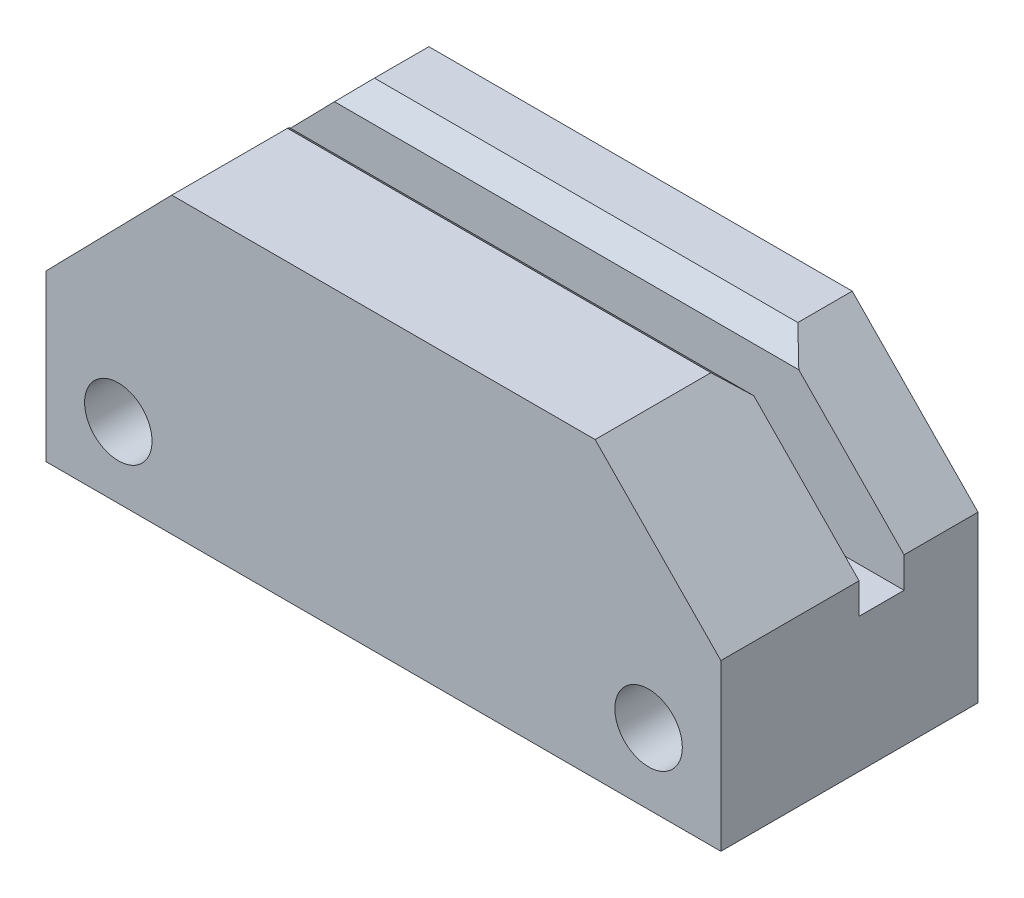
ISO-10303-21;
HEADER;
FILE_DESCRIPTION(('STEP AP214'),'2;1');
FILE_NAME('part.step','',(''),(''),'','','');
FILE_SCHEMA(('AUTOMOTIVE_DESIGN { 1 0 10303 214 1 1 1 1 }'));
ENDSEC;
DATA;
#1=APPLICATION_CONTEXT('core data for automotive mechanical design processes');
#2=APPLICATION_PROTOCOL_DEFINITION('international standard','automotive_design',2000,#1);
#3=PRODUCT_CONTEXT('',#1,'mechanical');
#4=PRODUCT('Part','Part','',(#3));
#5=PRODUCT_RELATED_PRODUCT_CATEGORY('part','',(#4));
#6=PRODUCT_DEFINITION_FORMATION('','',#4);
#7=PRODUCT_DEFINITION_CONTEXT('part definition',#1,'design');
#8=PRODUCT_DEFINITION('design','',#6,#7);
#9=PRODUCT_DEFINITION_SHAPE('','',#8);
#10=(LENGTH_UNIT() NAMED_UNIT(*) SI_UNIT(.MILLI.,.METRE.));
#11=(NAMED_UNIT(*) PLANE_ANGLE_UNIT() SI_UNIT($,.RADIAN.));
#12=(NAMED_UNIT(*) SI_UNIT($,.STERADIAN.) SOLID_ANGLE_UNIT());
#13=UNCERTAINTY_MEASURE_WITH_UNIT(LENGTH_MEASURE(1.E-05),#10,'distance_accuracy_value','');
#14=(GEOMETRIC_REPRESENTATION_CONTEXT(3) GLOBAL_UNCERTAINTY_ASSIGNED_CONTEXT((#13)) GLOBAL_UNIT_ASSIGNED_CONTEXT((#10,
#11,#12)) REPRESENTATION_CONTEXT('',''));
#15=CARTESIAN_POINT('',(0.,0.,0.));
#16=DIRECTION('',(0.,0.,1.));
#17=DIRECTION('',(1.,0.,0.));
#18=AXIS2_PLACEMENT_3D('',#15,#16,#17);
#19=CARTESIAN_POINT('',(9.41385546640759,1.0414,0.));
#20=DIRECTION('',(0.,0.,-1.));
#21=DIRECTION('',(-1.,0.,0.));
#22=AXIS2_PLACEMENT_3D('',#19,#20,#21);
#23=CYLINDRICAL_SURFACE('',#22,1.1938);
#24=CARTESIAN_POINT('',(9.41385546640759,1.0414,2.159));
#25=DIRECTION('',(0.,0.,-1.));
#26=DIRECTION('',(-1.,0.,0.));
#27=AXIS2_PLACEMENT_3D('',#24,#25,#26);
#28=CIRCLE('',#27,1.1938);
#29=CARTESIAN_POINT('',(9.41385546640759,2.2352,2.159));
#30=VERTEX_POINT('',#29);
#31=CARTESIAN_POINT('',(10.0269757964685,2.06572509530227,2.159));
#32=VERTEX_POINT('',#31);
#33=EDGE_CURVE('E232',#30,#32,#28,.T.);
#34=ORIENTED_EDGE('',*,*,#33,.F.);
#35=DIRECTION('',(0.,0.,1.));
#36=VECTOR('',#35,1.);
#37=CARTESIAN_POINT('',(9.41385546640759,2.2352,0.));
#38=LINE('',#37,#36);
#39=CARTESIAN_POINT('',(9.41385546640759,2.2352,0.));
#40=VERTEX_POINT('',#39);
#41=EDGE_CURVE('E178',#30,#40,#38,.F.);
#42=ORIENTED_EDGE('',*,*,#41,.T.);
#43=CARTESIAN_POINT('',(9.41385546640759,1.0414,0.));
#44=DIRECTION('',(0.,0.,-1.));
#45=DIRECTION('',(-1.,0.,0.));
#46=AXIS2_PLACEMENT_3D('',#43,#44,#45);
#47=CIRCLE('',#46,1.1938);
#48=CARTESIAN_POINT('',(10.0269757964685,2.06572509530224,0.));
#49=VERTEX_POINT('',#48);
#50=EDGE_CURVE('E19',#49,#40,#47,.F.);
#51=ORIENTED_EDGE('',*,*,#50,.F.);
#52=DIRECTION('',(0.,0.,1.));
#53=VECTOR('',#52,1.);
#54=CARTESIAN_POINT('',(10.0269757964685,2.06572509530225,0.));
#55=LINE('',#54,#53);
#56=EDGE_CURVE('E172',#49,#32,#55,.T.);
#57=ORIENTED_EDGE('',*,*,#56,.T.);
#58=EDGE_LOOP('',(#34,#42,#51,#57));
#59=FACE_BOUND('',#58,.T.);
#60=ADVANCED_FACE('F16',(#59),#23,.F.);
#61=CARTESIAN_POINT('',(13.335,4.2530223123202,2.921));
#62=DIRECTION('',(0.,-0.681925426496933,-0.731421706471018));
#63=DIRECTION('',(0.,0.731421706471018,-0.681925426496933));
#64=AXIS2_PLACEMENT_3D('',#61,#62,#63);
#65=PLANE('',#64);
#66=DIRECTION('',(-1.,0.,0.));
#67=VECTOR('',#66,1.);
#68=CARTESIAN_POINT('',(13.335,4.2530223123202,2.921));
#69=LINE('',#68,#67);
#70=CARTESIAN_POINT('',(-9.17443469446938,4.2530223123202,2.921));
#71=VERTEX_POINT('',#70);
#72=CARTESIAN_POINT('',(9.17443469446937,4.2530223123202,2.921));
#73=VERTEX_POINT('',#72);
#74=EDGE_CURVE('E258',#71,#73,#69,.F.);
#75=ORIENTED_EDGE('',*,*,#74,.T.);
#76=DIRECTION('',(0.581903337800259,-0.594834523084709,0.554581279528532));
#77=VECTOR('',#76,1.);
#78=CARTESIAN_POINT('',(8.36543478260869,5.08,2.14998499267215));
#79=LINE('',#78,#77);
#80=CARTESIAN_POINT('',(8.36543478260869,5.08,2.14998499267215));
#81=VERTEX_POINT('',#80);
#82=EDGE_CURVE('E180',#81,#73,#79,.T.);
#83=ORIENTED_EDGE('',*,*,#82,.F.);
#84=DIRECTION('',(1.,0.,0.));
#85=VECTOR('',#84,1.);
#86=CARTESIAN_POINT('',(13.335,5.08,2.14998499267215));
#87=LINE('',#86,#85);
#88=CARTESIAN_POINT('',(-8.3654347826087,5.08,2.14998499267215));
#89=VERTEX_POINT('',#88);
#90=EDGE_CURVE('E231',#89,#81,#87,.T.);
#91=ORIENTED_EDGE('',*,*,#90,.F.);
#92=DIRECTION('',(0.581903337800257,0.59483452308471,-0.554581279528533));
#93=VECTOR('',#92,1.);
#94=CARTESIAN_POINT('',(-9.17443469446937,4.2530223123202,2.921));
#95=LINE('',#94,#93);
#96=EDGE_CURVE('E173',#71,#89,#95,.T.);
#97=ORIENTED_EDGE('',*,*,#96,.F.);
#98=EDGE_LOOP('',(#75,#83,#91,#97));
#99=FACE_BOUND('',#98,.T.);
#100=ADVANCED_FACE('F259',(#99),#65,.F.);
#101=CARTESIAN_POINT('',(0.,0.,2.159));
#102=DIRECTION('',(0.,0.,-1.));
#103=DIRECTION('',(-1.,0.,0.));
#104=AXIS2_PLACEMENT_3D('',#101,#102,#103);
#105=PLANE('',#104);
#106=CARTESIAN_POINT('',(-8.636,1.016,2.159));
#107=DIRECTION('',(0.,0.,-1.));
#108=DIRECTION('',(-1.,0.,0.));
#109=AXIS2_PLACEMENT_3D('',#106,#107,#108);
#110=CIRCLE('',#109,1.2192);
#111=CARTESIAN_POINT('',(-9.8552,1.016,2.159));
#112=VERTEX_POINT('',#111);
#113=EDGE_CURVE('E229',#112,#112,#110,.T.);
#114=ORIENTED_EDGE('',*,*,#113,.T.);
#115=EDGE_LOOP('',(#114));
#116=FACE_BOUND('',#115,.T.);
#117=ADVANCED_FACE('F656',(#116),#105,.T.);
#118=CARTESIAN_POINT('',(10.0269757964685,2.06572509530225,0.));
#119=DIRECTION('',(0.513587141950879,0.858037439522733,0.));
#120=DIRECTION('',(-0.858037439522733,0.513587141950879,0.));
#121=AXIS2_PLACEMENT_3D('',#118,#119,#120);
#122=PLANE('',#121);
#123=DIRECTION('',(0.858037439522774,-0.513587141950811,0.));
#124=VECTOR('',#123,1.);
#125=CARTESIAN_POINT('',(10.0269757964685,2.06572509530225,2.159));
#126=LINE('',#125,#124);
#127=CARTESIAN_POINT('',(10.033,2.06211924626615,2.159));
#128=VERTEX_POINT('',#127);
#129=EDGE_CURVE('E183',#32,#128,#126,.T.);
#130=ORIENTED_EDGE('',*,*,#129,.F.);
#131=ORIENTED_EDGE('',*,*,#56,.F.);
#132=DIRECTION('',(-0.858037439522733,0.513587141950879,0.));
#133=VECTOR('',#132,1.);
#134=CARTESIAN_POINT('',(10.0269757964685,2.06572509530225,0.));
#135=LINE('',#134,#133);
#136=CARTESIAN_POINT('',(10.033,2.06211924626612,0.));
#137=VERTEX_POINT('',#136);
#138=EDGE_CURVE('E162',#137,#49,#135,.T.);
#139=ORIENTED_EDGE('',*,*,#138,.F.);
#140=DIRECTION('',(0.,0.,-1.));
#141=VECTOR('',#140,1.);
#142=CARTESIAN_POINT('',(10.033,2.06211924626613,0.));
#143=LINE('',#142,#141);
#144=EDGE_CURVE('E228',#137,#128,#143,.F.);
#145=ORIENTED_EDGE('',*,*,#144,.T.);
#146=EDGE_LOOP('',(#130,#131,#139,#145));
#147=FACE_BOUND('',#146,.T.);
#148=ADVANCED_FACE('F181',(#147),#122,.F.);
#149=CARTESIAN_POINT('',(9.40683455653351,-0.2032,0.));
#150=DIRECTION('',(0.,-1.,0.));
#151=DIRECTION('',(0.,0.,-1.));
#152=AXIS2_PLACEMENT_3D('',#149,#150,#151);
#153=PLANE('',#152);
#154=DIRECTION('',(-1.,0.,0.));
#155=VECTOR('',#154,1.);
#156=CARTESIAN_POINT('',(0.,-0.2032,2.159));
#157=LINE('',#156,#155);
#158=CARTESIAN_POINT('',(9.40683455653351,-0.2032,2.159));
#159=VERTEX_POINT('',#158);
#160=CARTESIAN_POINT('',(8.4582,-0.2032,2.159));
#161=VERTEX_POINT('',#160);
#162=EDGE_CURVE('E235',#159,#161,#157,.T.);
#163=ORIENTED_EDGE('',*,*,#162,.F.);
#164=DIRECTION('',(0.,0.,-1.));
#165=VECTOR('',#164,1.);
#166=CARTESIAN_POINT('',(9.40683455653351,-0.2032,0.));
#167=LINE('',#166,#165);
#168=CARTESIAN_POINT('',(9.40683455653351,-0.2032,0.));
#169=VERTEX_POINT('',#168);
#170=EDGE_CURVE('E227',#159,#169,#167,.T.);
#171=ORIENTED_EDGE('',*,*,#170,.T.);
#172=DIRECTION('',(1.,0.,0.));
#173=VECTOR('',#172,1.);
#174=CARTESIAN_POINT('',(9.40683455653351,-0.2032,0.));
#175=LINE('',#174,#173);
#176=CARTESIAN_POINT('',(8.4582,-0.2032,0.));
#177=VERTEX_POINT('',#176);
#178=EDGE_CURVE('E185',#177,#169,#175,.T.);
#179=ORIENTED_EDGE('',*,*,#178,.F.);
#180=DIRECTION('',(0.,0.,-1.));
#181=VECTOR('',#180,1.);
#182=CARTESIAN_POINT('',(8.4582,-0.2032,0.));
#183=LINE('',#182,#181);
#184=EDGE_CURVE('E223',#177,#161,#183,.F.);
#185=ORIENTED_EDGE('',*,*,#184,.T.);
#186=EDGE_LOOP('',(#163,#171,#179,#185));
#187=FACE_BOUND('',#186,.T.);
#188=ADVANCED_FACE('F641',(#187),#153,.F.);
#189=CARTESIAN_POINT('',(7.239,1.016,0.));
#190=DIRECTION('',(-1.,0.,0.));
#191=DIRECTION('',(0.,0.,1.));
#192=AXIS2_PLACEMENT_3D('',#189,#190,#191);
#193=PLANE('',#192);
#194=DIRECTION('',(0.,1.,0.));
#195=VECTOR('',#194,1.);
#196=CARTESIAN_POINT('',(7.239,0.,2.159));
#197=LINE('',#196,#195);
#198=CARTESIAN_POINT('',(7.239,1.016,2.159));
#199=VERTEX_POINT('',#198);
#200=CARTESIAN_POINT('',(7.239,1.0414,2.159));
#201=VERTEX_POINT('',#200);
#202=EDGE_CURVE('E298',#199,#201,#197,.T.);
#203=ORIENTED_EDGE('',*,*,#202,.F.);
#204=DIRECTION('',(0.,0.,-1.));
#205=VECTOR('',#204,1.);
#206=CARTESIAN_POINT('',(7.239,1.016,0.));
#207=LINE('',#206,#205);
#208=CARTESIAN_POINT('',(7.239,1.016,0.));
#209=VERTEX_POINT('',#208);
#210=EDGE_CURVE('E222',#199,#209,#207,.T.);
#211=ORIENTED_EDGE('',*,*,#210,.T.);
#212=DIRECTION('',(0.,1.,0.));
#213=VECTOR('',#212,1.);
#214=CARTESIAN_POINT('',(7.239,1.016,0.));
#215=LINE('',#214,#213);
#216=CARTESIAN_POINT('',(7.239,1.0414,0.));
#217=VERTEX_POINT('',#216);
#218=EDGE_CURVE('E187',#217,#209,#215,.F.);
#219=ORIENTED_EDGE('',*,*,#218,.F.);
#220=DIRECTION('',(0.,0.,-1.));
#221=VECTOR('',#220,1.);
#222=CARTESIAN_POINT('',(7.239,1.0414,0.));
#223=LINE('',#222,#221);
#224=EDGE_CURVE('E218',#217,#201,#223,.F.);
#225=ORIENTED_EDGE('',*,*,#224,.T.);
#226=EDGE_LOOP('',(#203,#211,#219,#225));
#227=FACE_BOUND('',#226,.T.);
#228=ADVANCED_FACE('F312',(#227),#193,.F.);
#229=CARTESIAN_POINT('',(0.,0.,2.159));
#230=DIRECTION('',(0.,0.,-1.));
#231=DIRECTION('',(-1.,0.,0.));
#232=AXIS2_PLACEMENT_3D('',#229,#230,#231);
#233=PLANE('',#232);
#234=CARTESIAN_POINT('',(8.4328,1.0414,2.159));
#235=DIRECTION('',(0.,0.,-1.));
#236=DIRECTION('',(-1.,0.,0.));
#237=AXIS2_PLACEMENT_3D('',#234,#235,#236);
#238=CIRCLE('',#237,1.1938);
#239=CARTESIAN_POINT('',(8.4328,2.2352,2.159));
#240=VERTEX_POINT('',#239);
#241=EDGE_CURVE('E215',#201,#240,#238,.T.);
#242=ORIENTED_EDGE('',*,*,#241,.T.);
#243=DIRECTION('',(1.,0.,0.));
#244=VECTOR('',#243,1.);
#245=CARTESIAN_POINT('',(8.4328,2.2352,2.159));
#246=LINE('',#245,#244);
#247=EDGE_CURVE('E297',#240,#30,#246,.T.);
#248=ORIENTED_EDGE('',*,*,#247,.T.);
#249=ORIENTED_EDGE('',*,*,#33,.T.);
#250=ORIENTED_EDGE('',*,*,#129,.T.);
#251=CARTESIAN_POINT('',(9.40683455653351,1.016,2.159));
#252=DIRECTION('',(0.,0.,-1.));
#253=DIRECTION('',(-1.,0.,0.));
#254=AXIS2_PLACEMENT_3D('',#251,#252,#253);
#255=CIRCLE('',#254,1.2192);
#256=EDGE_CURVE('E224',#128,#159,#255,.T.);
#257=ORIENTED_EDGE('',*,*,#256,.T.);
#258=ORIENTED_EDGE('',*,*,#162,.T.);
#259=CARTESIAN_POINT('',(8.4582,1.016,2.159));
#260=DIRECTION('',(0.,0.,-1.));
#261=DIRECTION('',(-1.,0.,0.));
#262=AXIS2_PLACEMENT_3D('',#259,#260,#261);
#263=CIRCLE('',#262,1.2192);
#264=EDGE_CURVE('E219',#161,#199,#263,.T.);
#265=ORIENTED_EDGE('',*,*,#264,.T.);
#266=ORIENTED_EDGE('',*,*,#202,.T.);
#267=EDGE_LOOP('',(#242,#248,#249,#250,#257,#258,#265,#266));
#268=FACE_BOUND('',#267,.T.);
#269=ADVANCED_FACE('F303',(#268),#233,.T.);
#270=CARTESIAN_POINT('',(8.4328,2.2352,0.));
#271=DIRECTION('',(0.,1.,0.));
#272=DIRECTION('',(0.,0.,1.));
#273=AXIS2_PLACEMENT_3D('',#270,#271,#272);
#274=PLANE('',#273);
#275=ORIENTED_EDGE('',*,*,#247,.F.);
#276=DIRECTION('',(0.,0.,-1.));
#277=VECTOR('',#276,1.);
#278=CARTESIAN_POINT('',(8.4328,2.2352,0.));
#279=LINE('',#278,#277);
#280=CARTESIAN_POINT('',(8.4328,2.2352,0.));
#281=VERTEX_POINT('',#280);
#282=EDGE_CURVE('E217',#240,#281,#279,.T.);
#283=ORIENTED_EDGE('',*,*,#282,.T.);
#284=DIRECTION('',(1.,0.,0.));
#285=VECTOR('',#284,1.);
#286=CARTESIAN_POINT('',(8.4328,2.2352,0.));
#287=LINE('',#286,#285);
#288=EDGE_CURVE('E295',#40,#281,#287,.F.);
#289=ORIENTED_EDGE('',*,*,#288,.F.);
#290=ORIENTED_EDGE('',*,*,#41,.F.);
#291=EDGE_LOOP('',(#275,#283,#289,#290));
#292=FACE_BOUND('',#291,.T.);
#293=ADVANCED_FACE('F320',(#292),#274,.F.);
#294=CARTESIAN_POINT('',(13.335,-1.21361666226093,2.921));
#295=DIRECTION('',(0.,0.,-1.));
#296=DIRECTION('',(-1.,0.,0.));
#297=AXIS2_PLACEMENT_3D('',#294,#295,#296);
#298=PLANE('',#297);
#299=DIRECTION('',(0.,1.,0.));
#300=VECTOR('',#299,1.);
#301=CARTESIAN_POINT('',(13.335,-1.21361666226093,2.921));
#302=LINE('',#301,#300);
#303=CARTESIAN_POINT('',(13.335,0.,2.921));
#304=VERTEX_POINT('',#303);
#305=CARTESIAN_POINT('',(13.335,-1.21361666226093,2.921));
#306=VERTEX_POINT('',#305);
#307=EDGE_CURVE('E263',#304,#306,#302,.F.);
#308=ORIENTED_EDGE('',*,*,#307,.F.);
#309=DIRECTION('',(-0.699294155463731,0.714834025585147,0.));
#310=VECTOR('',#309,1.);
#311=CARTESIAN_POINT('',(7.62,5.842,2.921));
#312=LINE('',#311,#310);
#313=EDGE_CURVE('E250',#73,#304,#312,.F.);
#314=ORIENTED_EDGE('',*,*,#313,.F.);
#315=ORIENTED_EDGE('',*,*,#74,.F.);
#316=DIRECTION('',(0.699294155463731,0.714834025585147,0.));
#317=VECTOR('',#316,1.);
#318=CARTESIAN_POINT('',(-7.62,5.842,2.921));
#319=LINE('',#318,#317);
#320=CARTESIAN_POINT('',(-13.335,0.,2.921));
#321=VERTEX_POINT('',#320);
#322=EDGE_CURVE('E278',#71,#321,#319,.F.);
#323=ORIENTED_EDGE('',*,*,#322,.T.);
#324=DIRECTION('',(0.,1.,0.));
#325=VECTOR('',#324,1.);
#326=CARTESIAN_POINT('',(-13.335,-1.21361666226093,2.921));
#327=LINE('',#326,#325);
#328=CARTESIAN_POINT('',(-13.335,-1.21361666226093,2.921));
#329=VERTEX_POINT('',#328);
#330=EDGE_CURVE('E264',#329,#321,#327,.T.);
#331=ORIENTED_EDGE('',*,*,#330,.F.);
#332=DIRECTION('',(1.,0.,0.));
#333=VECTOR('',#332,1.);
#334=CARTESIAN_POINT('',(13.335,-1.21361666226093,2.921));
#335=LINE('',#334,#333);
#336=EDGE_CURVE('E268',#329,#306,#335,.T.);
#337=ORIENTED_EDGE('',*,*,#336,.T.);
#338=EDGE_LOOP('',(#308,#314,#315,#323,#331,#337));
#339=FACE_BOUND('',#338,.T.);
#340=ADVANCED_FACE('F266',(#339),#298,.F.);
#341=CARTESIAN_POINT('',(13.335,5.08,0.));
#342=DIRECTION('',(0.,1.,0.));
#343=DIRECTION('',(0.,0.,1.));
#344=AXIS2_PLACEMENT_3D('',#341,#342,#343);
#345=PLANE('',#344);
#346=DIRECTION('',(0.,0.,1.));
#347=VECTOR('',#346,1.);
#348=CARTESIAN_POINT('',(-8.3654347826087,5.08,0.));
#349=LINE('',#348,#347);
#350=CARTESIAN_POINT('',(-8.3654347826087,5.08,0.));
#351=VERTEX_POINT('',#350);
#352=EDGE_CURVE('E272',#351,#89,#349,.T.);
#353=ORIENTED_EDGE('',*,*,#352,.T.);
#354=ORIENTED_EDGE('',*,*,#90,.T.);
#355=DIRECTION('',(0.,0.,1.));
#356=VECTOR('',#355,1.);
#357=CARTESIAN_POINT('',(8.3654347826087,5.08,0.));
#358=LINE('',#357,#356);
#359=CARTESIAN_POINT('',(8.36543478260869,5.08,0.));
#360=VERTEX_POINT('',#359);
#361=EDGE_CURVE('E253',#360,#81,#358,.T.);
#362=ORIENTED_EDGE('',*,*,#361,.F.);
#363=DIRECTION('',(1.,0.,0.));
#364=VECTOR('',#363,1.);
#365=CARTESIAN_POINT('',(0.,5.08,0.));
#366=LINE('',#365,#364);
#367=EDGE_CURVE('E408',#360,#351,#366,.F.);
#368=ORIENTED_EDGE('',*,*,#367,.T.);
#369=EDGE_LOOP('',(#353,#354,#362,#368));
#370=FACE_BOUND('',#369,.T.);
#371=ADVANCED_FACE('F328',(#370),#345,.T.);
#372=CARTESIAN_POINT('',(-8.636,1.016,0.));
#373=DIRECTION('',(0.,0.,-1.));
#374=DIRECTION('',(-1.,0.,0.));
#375=AXIS2_PLACEMENT_3D('',#372,#373,#374);
#376=CYLINDRICAL_SURFACE('',#375,1.2192);
#377=ORIENTED_EDGE('',*,*,#113,.F.);
#378=EDGE_LOOP('',(#377));
#379=FACE_BOUND('',#378,.T.);
#380=CARTESIAN_POINT('',(-8.636,1.016,0.));
#381=DIRECTION('',(0.,0.,-1.));
#382=DIRECTION('',(-1.,0.,0.));
#383=AXIS2_PLACEMENT_3D('',#380,#381,#382);
#384=CIRCLE('',#383,1.2192);
#385=CARTESIAN_POINT('',(-9.8552,1.016,0.));
#386=VERTEX_POINT('',#385);
#387=EDGE_CURVE('E211',#386,#386,#384,.T.);
#388=ORIENTED_EDGE('',*,*,#387,.T.);
#389=EDGE_LOOP('',(#388));
#390=FACE_BOUND('',#389,.T.);
#391=ADVANCED_FACE('F397',(#379,#390),#376,.F.);
#392=CARTESIAN_POINT('',(9.40683455653351,1.016,0.));
#393=DIRECTION('',(0.,0.,-1.));
#394=DIRECTION('',(-1.,0.,0.));
#395=AXIS2_PLACEMENT_3D('',#392,#393,#394);
#396=CYLINDRICAL_SURFACE('',#395,1.2192);
#397=ORIENTED_EDGE('',*,*,#256,.F.);
#398=ORIENTED_EDGE('',*,*,#144,.F.);
#399=CARTESIAN_POINT('',(9.40683455653351,1.016,0.));
#400=DIRECTION('',(0.,0.,-1.));
#401=DIRECTION('',(-1.,0.,0.));
#402=AXIS2_PLACEMENT_3D('',#399,#400,#401);
#403=CIRCLE('',#402,1.2192);
#404=EDGE_CURVE('E168',#137,#169,#403,.T.);
#405=ORIENTED_EDGE('',*,*,#404,.T.);
#406=ORIENTED_EDGE('',*,*,#170,.F.);
#407=EDGE_LOOP('',(#397,#398,#405,#406));
#408=FACE_BOUND('',#407,.T.);
#409=ADVANCED_FACE('F394',(#408),#396,.F.);
#410=CARTESIAN_POINT('',(8.4582,1.016,0.));
#411=DIRECTION('',(0.,0.,-1.));
#412=DIRECTION('',(-1.,0.,0.));
#413=AXIS2_PLACEMENT_3D('',#410,#411,#412);
#414=CYLINDRICAL_SURFACE('',#413,1.2192);
#415=ORIENTED_EDGE('',*,*,#264,.F.);
#416=ORIENTED_EDGE('',*,*,#184,.F.);
#417=CARTESIAN_POINT('',(8.4582,1.016,0.));
#418=DIRECTION('',(0.,0.,-1.));
#419=DIRECTION('',(-1.,0.,0.));
#420=AXIS2_PLACEMENT_3D('',#417,#418,#419);
#421=CIRCLE('',#420,1.2192);
#422=EDGE_CURVE('E207',#177,#209,#421,.T.);
#423=ORIENTED_EDGE('',*,*,#422,.T.);
#424=ORIENTED_EDGE('',*,*,#210,.F.);
#425=EDGE_LOOP('',(#415,#416,#423,#424));
#426=FACE_BOUND('',#425,.T.);
#427=ADVANCED_FACE('F310',(#426),#414,.F.);
#428=CARTESIAN_POINT('',(8.4328,1.0414,0.));
#429=DIRECTION('',(0.,0.,-1.));
#430=DIRECTION('',(-1.,0.,0.));
#431=AXIS2_PLACEMENT_3D('',#428,#429,#430);
#432=CYLINDRICAL_SURFACE('',#431,1.1938);
#433=ORIENTED_EDGE('',*,*,#241,.F.);
#434=ORIENTED_EDGE('',*,*,#224,.F.);
#435=CARTESIAN_POINT('',(8.4328,1.0414,0.));
#436=DIRECTION('',(0.,0.,-1.));
#437=DIRECTION('',(-1.,0.,0.));
#438=AXIS2_PLACEMENT_3D('',#435,#436,#437);
#439=CIRCLE('',#438,1.1938);
#440=EDGE_CURVE('E203',#217,#281,#439,.T.);
#441=ORIENTED_EDGE('',*,*,#440,.T.);
#442=ORIENTED_EDGE('',*,*,#282,.F.);
#443=EDGE_LOOP('',(#433,#434,#441,#442));
#444=FACE_BOUND('',#443,.T.);
#445=ADVANCED_FACE('F318',(#444),#432,.F.);
#446=CARTESIAN_POINT('',(13.335,5.08,5.58600231437815));
#447=DIRECTION('',(0.,-0.731421706470944,0.681925426497013));
#448=DIRECTION('',(0.,-0.681925426497013,-0.731421706470944));
#449=AXIS2_PLACEMENT_3D('',#446,#447,#448);
#450=PLANE('',#449);
#451=DIRECTION('',(1.,0.,0.));
#452=VECTOR('',#451,1.);
#453=CARTESIAN_POINT('',(13.335,4.2530223123202,4.699));
#454=LINE('',#453,#452);
#455=CARTESIAN_POINT('',(9.17443469446937,4.2530223123202,4.699));
#456=VERTEX_POINT('',#455);
#457=CARTESIAN_POINT('',(-9.17443469446938,4.25302231232019,4.699));
#458=VERTEX_POINT('',#457);
#459=EDGE_CURVE('E423',#456,#458,#454,.F.);
#460=ORIENTED_EDGE('',*,*,#459,.T.);
#461=DIRECTION('',(-0.554950289504118,-0.567282518159767,-0.608457657335011));
#462=VECTOR('',#461,1.);
#463=CARTESIAN_POINT('',(-8.36543478260871,5.08,5.58600231437815));
#464=LINE('',#463,#462);
#465=CARTESIAN_POINT('',(-8.3654347826087,5.08,5.58600231437815));
#466=VERTEX_POINT('',#465);
#467=EDGE_CURVE('E282',#466,#458,#464,.T.);
#468=ORIENTED_EDGE('',*,*,#467,.F.);
#469=DIRECTION('',(1.,0.,0.));
#470=VECTOR('',#469,1.);
#471=CARTESIAN_POINT('',(13.335,5.08,5.58600231437815));
#472=LINE('',#471,#470);
#473=CARTESIAN_POINT('',(8.36543478260869,5.08,5.58600231437815));
#474=VERTEX_POINT('',#473);
#475=EDGE_CURVE('E206',#474,#466,#472,.F.);
#476=ORIENTED_EDGE('',*,*,#475,.F.);
#477=DIRECTION('',(-0.55495028950412,0.567282518159766,0.60845765733501));
#478=VECTOR('',#477,1.);
#479=CARTESIAN_POINT('',(9.17443469446937,4.2530223123202,4.699));
#480=LINE('',#479,#478);
#481=EDGE_CURVE('E280',#456,#474,#480,.T.);
#482=ORIENTED_EDGE('',*,*,#481,.F.);
#483=EDGE_LOOP('',(#460,#468,#476,#482));
#484=FACE_BOUND('',#483,.T.);
#485=ADVANCED_FACE('F385',(#484),#450,.F.);
#486=CARTESIAN_POINT('',(-7.62,5.842,0.));
#487=DIRECTION('',(0.714834025585147,-0.699294155463731,0.));
#488=DIRECTION('',(0.699294155463731,0.714834025585147,0.));
#489=AXIS2_PLACEMENT_3D('',#486,#487,#488);
#490=PLANE('',#489);
#491=ORIENTED_EDGE('',*,*,#352,.F.);
#492=DIRECTION('',(-0.699294155463731,-0.714834025585148,0.));
#493=VECTOR('',#492,1.);
#494=CARTESIAN_POINT('',(-8.3654347826087,5.08,0.));
#495=LINE('',#494,#493);
#496=CARTESIAN_POINT('',(-13.335,0.,0.));
#497=VERTEX_POINT('',#496);
#498=EDGE_CURVE('E214',#351,#497,#495,.T.);
#499=ORIENTED_EDGE('',*,*,#498,.T.);
#500=DIRECTION('',(0.,0.,1.));
#501=VECTOR('',#500,1.);
#502=CARTESIAN_POINT('',(-13.335,0.,0.));
#503=LINE('',#502,#501);
#504=EDGE_CURVE('E463',#321,#497,#503,.F.);
#505=ORIENTED_EDGE('',*,*,#504,.F.);
#506=ORIENTED_EDGE('',*,*,#322,.F.);
#507=ORIENTED_EDGE('',*,*,#96,.T.);
#508=EDGE_LOOP('',(#491,#499,#505,#506,#507));
#509=FACE_BOUND('',#508,.T.);
#510=ADVANCED_FACE('F382',(#509),#490,.F.);
#511=CARTESIAN_POINT('',(7.62,5.842,0.));
#512=DIRECTION('',(0.714834025585147,0.699294155463731,0.));
#513=DIRECTION('',(-0.699294155463731,0.714834025585147,0.));
#514=AXIS2_PLACEMENT_3D('',#511,#512,#513);
#515=PLANE('',#514);
#516=ORIENTED_EDGE('',*,*,#82,.T.);
#517=ORIENTED_EDGE('',*,*,#313,.T.);
#518=DIRECTION('',(0.,0.,-1.));
#519=VECTOR('',#518,1.);
#520=CARTESIAN_POINT('',(13.335,0.,0.));
#521=LINE('',#520,#519);
#522=CARTESIAN_POINT('',(13.335,0.,0.));
#523=VERTEX_POINT('',#522);
#524=EDGE_CURVE('E441',#523,#304,#521,.F.);
#525=ORIENTED_EDGE('',*,*,#524,.F.);
#526=DIRECTION('',(-0.699294155463731,0.714834025585148,0.));
#527=VECTOR('',#526,1.);
#528=CARTESIAN_POINT('',(13.335,0.,0.));
#529=LINE('',#528,#527);
#530=EDGE_CURVE('E417',#523,#360,#529,.T.);
#531=ORIENTED_EDGE('',*,*,#530,.T.);
#532=ORIENTED_EDGE('',*,*,#361,.T.);
#533=EDGE_LOOP('',(#516,#517,#525,#531,#532));
#534=FACE_BOUND('',#533,.T.);
#535=ADVANCED_FACE('F247',(#534),#515,.T.);
#536=CARTESIAN_POINT('',(13.335,-1.21361666226093,4.699));
#537=DIRECTION('',(0.,-1.,0.));
#538=DIRECTION('',(0.,0.,-1.));
#539=AXIS2_PLACEMENT_3D('',#536,#537,#538);
#540=PLANE('',#539);
#541=DIRECTION('',(0.,0.,-1.));
#542=VECTOR('',#541,1.);
#543=CARTESIAN_POINT('',(13.335,-1.21361666226093,0.));
#544=LINE('',#543,#542);
#545=CARTESIAN_POINT('',(13.335,-1.21361666226093,4.699));
#546=VERTEX_POINT('',#545);
#547=EDGE_CURVE('E430',#306,#546,#544,.F.);
#548=ORIENTED_EDGE('',*,*,#547,.F.);
#549=ORIENTED_EDGE('',*,*,#336,.F.);
#550=DIRECTION('',(0.,0.,1.));
#551=VECTOR('',#550,1.);
#552=CARTESIAN_POINT('',(-13.335,-1.21361666226093,0.));
#553=LINE('',#552,#551);
#554=CARTESIAN_POINT('',(-13.335,-1.21361666226093,4.699));
#555=VERTEX_POINT('',#554);
#556=EDGE_CURVE('E432',#555,#329,#553,.F.);
#557=ORIENTED_EDGE('',*,*,#556,.F.);
#558=DIRECTION('',(1.,0.,0.));
#559=VECTOR('',#558,1.);
#560=CARTESIAN_POINT('',(13.335,-1.21361666226093,4.699));
#561=LINE('',#560,#559);
#562=EDGE_CURVE('E270',#555,#546,#561,.T.);
#563=ORIENTED_EDGE('',*,*,#562,.T.);
#564=EDGE_LOOP('',(#548,#549,#557,#563));
#565=FACE_BOUND('',#564,.T.);
#566=ADVANCED_FACE('F375',(#565),#540,.F.);
#567=CARTESIAN_POINT('',(13.335,4.2530223123202,4.699));
#568=DIRECTION('',(0.,0.,1.));
#569=DIRECTION('',(1.,0.,0.));
#570=AXIS2_PLACEMENT_3D('',#567,#568,#569);
#571=PLANE('',#570);
#572=ORIENTED_EDGE('',*,*,#459,.F.);
#573=DIRECTION('',(-0.699294155463731,0.714834025585147,0.));
#574=VECTOR('',#573,1.);
#575=CARTESIAN_POINT('',(7.62,5.842,4.699));
#576=LINE('',#575,#574);
#577=CARTESIAN_POINT('',(13.335,0.,4.699));
#578=VERTEX_POINT('',#577);
#579=EDGE_CURVE('E202',#578,#456,#576,.T.);
#580=ORIENTED_EDGE('',*,*,#579,.F.);
#581=DIRECTION('',(0.,1.,0.));
#582=VECTOR('',#581,1.);
#583=CARTESIAN_POINT('',(13.335,-6.5278,4.699));
#584=LINE('',#583,#582);
#585=EDGE_CURVE('E436',#546,#578,#584,.T.);
#586=ORIENTED_EDGE('',*,*,#585,.F.);
#587=ORIENTED_EDGE('',*,*,#562,.F.);
#588=DIRECTION('',(0.,1.,0.));
#589=VECTOR('',#588,1.);
#590=CARTESIAN_POINT('',(-13.335,5.08,4.699));
#591=LINE('',#590,#589);
#592=CARTESIAN_POINT('',(-13.335,0.,4.699));
#593=VERTEX_POINT('',#592);
#594=EDGE_CURVE('E457',#593,#555,#591,.F.);
#595=ORIENTED_EDGE('',*,*,#594,.F.);
#596=DIRECTION('',(0.699294155463731,0.714834025585147,0.));
#597=VECTOR('',#596,1.);
#598=CARTESIAN_POINT('',(-7.62,5.842,4.699));
#599=LINE('',#598,#597);
#600=EDGE_CURVE('E466',#593,#458,#599,.T.);
#601=ORIENTED_EDGE('',*,*,#600,.T.);
#602=EDGE_LOOP('',(#572,#580,#586,#587,#595,#601));
#603=FACE_BOUND('',#602,.T.);
#604=ADVANCED_FACE('F372',(#603),#571,.F.);
#605=CARTESIAN_POINT('',(0.,0.,0.));
#606=DIRECTION('',(0.,0.,1.));
#607=DIRECTION('',(1.,0.,0.));
#608=AXIS2_PLACEMENT_3D('',#605,#606,#607);
#609=PLANE('',#608);
#610=ORIENTED_EDGE('',*,*,#218,.T.);
#611=ORIENTED_EDGE('',*,*,#422,.F.);
#612=ORIENTED_EDGE('',*,*,#178,.T.);
#613=ORIENTED_EDGE('',*,*,#404,.F.);
#614=ORIENTED_EDGE('',*,*,#138,.T.);
#615=ORIENTED_EDGE('',*,*,#50,.T.);
#616=ORIENTED_EDGE('',*,*,#288,.T.);
#617=ORIENTED_EDGE('',*,*,#440,.F.);
#618=EDGE_LOOP('',(#610,#611,#612,#613,#614,#615,#616,#617));
#619=FACE_BOUND('',#618,.T.);
#620=ORIENTED_EDGE('',*,*,#387,.F.);
#621=EDGE_LOOP('',(#620));
#622=FACE_BOUND('',#621,.T.);
#623=CARTESIAN_POINT('',(10.4775,-3.7338,0.));
#624=DIRECTION('',(0.,0.,1.));
#625=DIRECTION('',(1.,0.,0.));
#626=AXIS2_PLACEMENT_3D('',#623,#624,#625);
#627=CIRCLE('',#626,1.3335);
#628=CARTESIAN_POINT('',(11.811,-3.7338,0.));
#629=VERTEX_POINT('',#628);
#630=EDGE_CURVE('E195',#629,#629,#627,.T.);
#631=ORIENTED_EDGE('',*,*,#630,.T.);
#632=EDGE_LOOP('',(#631));
#633=FACE_BOUND('',#632,.T.);
#634=CARTESIAN_POINT('',(-10.4775,-3.7338,0.));
#635=DIRECTION('',(0.,0.,-1.));
#636=DIRECTION('',(-1.,0.,0.));
#637=AXIS2_PLACEMENT_3D('',#634,#635,#636);
#638=CIRCLE('',#637,1.3335);
#639=CARTESIAN_POINT('',(-11.811,-3.7338,0.));
#640=VERTEX_POINT('',#639);
#641=EDGE_CURVE('E199',#640,#640,#638,.F.);
#642=ORIENTED_EDGE('',*,*,#641,.T.);
#643=EDGE_LOOP('',(#642));
#644=FACE_BOUND('',#643,.T.);
#645=DIRECTION('',(1.,0.,0.));
#646=VECTOR('',#645,1.);
#647=CARTESIAN_POINT('',(-13.335,-6.5278,0.));
#648=LINE('',#647,#646);
#649=CARTESIAN_POINT('',(-13.335,-6.5278,0.));
#650=VERTEX_POINT('',#649);
#651=CARTESIAN_POINT('',(13.335,-6.5278,0.));
#652=VERTEX_POINT('',#651);
#653=EDGE_CURVE('E452',#650,#652,#648,.T.);
#654=ORIENTED_EDGE('',*,*,#653,.F.);
#655=DIRECTION('',(0.,1.,0.));
#656=VECTOR('',#655,1.);
#657=CARTESIAN_POINT('',(-13.335,5.08,0.));
#658=LINE('',#657,#656);
#659=EDGE_CURVE('E414',#497,#650,#658,.F.);
#660=ORIENTED_EDGE('',*,*,#659,.F.);
#661=ORIENTED_EDGE('',*,*,#498,.F.);
#662=ORIENTED_EDGE('',*,*,#367,.F.);
#663=ORIENTED_EDGE('',*,*,#530,.F.);
#664=DIRECTION('',(0.,1.,0.));
#665=VECTOR('',#664,1.);
#666=CARTESIAN_POINT('',(13.335,-6.5278,0.));
#667=LINE('',#666,#665);
#668=EDGE_CURVE('E443',#652,#523,#667,.T.);
#669=ORIENTED_EDGE('',*,*,#668,.F.);
#670=EDGE_LOOP('',(#654,#660,#661,#662,#663,#669));
#671=FACE_BOUND('',#670,.T.);
#672=ADVANCED_FACE('F164',(#619,#622,#633,#644,#671),#609,.F.);
#673=CARTESIAN_POINT('',(13.335,5.08,0.));
#674=DIRECTION('',(0.,1.,0.));
#675=DIRECTION('',(0.,0.,1.));
#676=AXIS2_PLACEMENT_3D('',#673,#674,#675);
#677=PLANE('',#676);
#678=DIRECTION('',(0.,0.,1.));
#679=VECTOR('',#678,1.);
#680=CARTESIAN_POINT('',(8.3654347826087,5.08,0.));
#681=LINE('',#680,#679);
#682=CARTESIAN_POINT('',(8.36543478260869,5.08,10.16));
#683=VERTEX_POINT('',#682);
#684=EDGE_CURVE('E439',#474,#683,#681,.T.);
#685=ORIENTED_EDGE('',*,*,#684,.F.);
#686=ORIENTED_EDGE('',*,*,#475,.T.);
#687=DIRECTION('',(0.,0.,1.));
#688=VECTOR('',#687,1.);
#689=CARTESIAN_POINT('',(-8.3654347826087,5.08,0.));
#690=LINE('',#689,#688);
#691=CARTESIAN_POINT('',(-8.3654347826087,5.08,10.16));
#692=VERTEX_POINT('',#691);
#693=EDGE_CURVE('E468',#466,#692,#690,.T.);
#694=ORIENTED_EDGE('',*,*,#693,.T.);
#695=DIRECTION('',(1.,0.,0.));
#696=VECTOR('',#695,1.);
#697=CARTESIAN_POINT('',(0.,5.08,10.16));
#698=LINE('',#697,#696);
#699=EDGE_CURVE('E198',#683,#692,#698,.F.);
#700=ORIENTED_EDGE('',*,*,#699,.F.);
#701=EDGE_LOOP('',(#685,#686,#694,#700));
#702=FACE_BOUND('',#701,.T.);
#703=ADVANCED_FACE('F365',(#702),#677,.T.);
#704=CARTESIAN_POINT('',(-7.62,5.842,0.));
#705=DIRECTION('',(0.714834025585147,-0.699294155463731,0.));
#706=DIRECTION('',(0.699294155463731,0.714834025585147,0.));
#707=AXIS2_PLACEMENT_3D('',#704,#705,#706);
#708=PLANE('',#707);
#709=DIRECTION('',(0.,0.,1.));
#710=VECTOR('',#709,1.);
#711=CARTESIAN_POINT('',(-13.335,0.,0.));
#712=LINE('',#711,#710);
#713=CARTESIAN_POINT('',(-13.335,0.,10.16));
#714=VERTEX_POINT('',#713);
#715=EDGE_CURVE('E459',#714,#593,#712,.F.);
#716=ORIENTED_EDGE('',*,*,#715,.F.);
#717=DIRECTION('',(-0.699294155463731,-0.714834025585148,0.));
#718=VECTOR('',#717,1.);
#719=CARTESIAN_POINT('',(-8.3654347826087,5.08,10.16));
#720=LINE('',#719,#718);
#721=EDGE_CURVE('E476',#692,#714,#720,.T.);
#722=ORIENTED_EDGE('',*,*,#721,.F.);
#723=ORIENTED_EDGE('',*,*,#693,.F.);
#724=ORIENTED_EDGE('',*,*,#467,.T.);
#725=ORIENTED_EDGE('',*,*,#600,.F.);
#726=EDGE_LOOP('',(#716,#722,#723,#724,#725));
#727=FACE_BOUND('',#726,.T.);
#728=ADVANCED_FACE('F361',(#727),#708,.F.);
#729=CARTESIAN_POINT('',(-13.335,5.08,0.));
#730=DIRECTION('',(-1.,0.,0.));
#731=DIRECTION('',(0.,0.,1.));
#732=AXIS2_PLACEMENT_3D('',#729,#730,#731);
#733=PLANE('',#732);
#734=ORIENTED_EDGE('',*,*,#715,.T.);
#735=ORIENTED_EDGE('',*,*,#594,.T.);
#736=ORIENTED_EDGE('',*,*,#556,.T.);
#737=ORIENTED_EDGE('',*,*,#330,.T.);
#738=ORIENTED_EDGE('',*,*,#504,.T.);
#739=ORIENTED_EDGE('',*,*,#659,.T.);
#740=DIRECTION('',(0.,0.,-1.));
#741=VECTOR('',#740,1.);
#742=CARTESIAN_POINT('',(-13.335,-6.5278,0.));
#743=LINE('',#742,#741);
#744=CARTESIAN_POINT('',(-13.335,-6.5278,10.16));
#745=VERTEX_POINT('',#744);
#746=EDGE_CURVE('E454',#745,#650,#743,.T.);
#747=ORIENTED_EDGE('',*,*,#746,.F.);
#748=DIRECTION('',(0.,1.,0.));
#749=VECTOR('',#748,1.);
#750=CARTESIAN_POINT('',(-13.335,0.,10.16));
#751=LINE('',#750,#749);
#752=EDGE_CURVE('E481',#714,#745,#751,.F.);
#753=ORIENTED_EDGE('',*,*,#752,.F.);
#754=EDGE_LOOP('',(#734,#735,#736,#737,#738,#739,#747,#753));
#755=FACE_BOUND('',#754,.T.);
#756=ADVANCED_FACE('F357',(#755),#733,.T.);
#757=CARTESIAN_POINT('',(-13.335,-6.5278,0.));
#758=DIRECTION('',(0.,-1.,0.));
#759=DIRECTION('',(0.,0.,-1.));
#760=AXIS2_PLACEMENT_3D('',#757,#758,#759);
#761=PLANE('',#760);
#762=ORIENTED_EDGE('',*,*,#746,.T.);
#763=ORIENTED_EDGE('',*,*,#653,.T.);
#764=DIRECTION('',(0.,0.,-1.));
#765=VECTOR('',#764,1.);
#766=CARTESIAN_POINT('',(13.335,-6.5278,0.));
#767=LINE('',#766,#765);
#768=CARTESIAN_POINT('',(13.335,-6.5278,10.16));
#769=VERTEX_POINT('',#768);
#770=EDGE_CURVE('E449',#769,#652,#767,.T.);
#771=ORIENTED_EDGE('',*,*,#770,.F.);
#772=DIRECTION('',(1.,0.,0.));
#773=VECTOR('',#772,1.);
#774=CARTESIAN_POINT('',(0.,-6.5278,10.16));
#775=LINE('',#774,#773);
#776=EDGE_CURVE('E491',#745,#769,#775,.T.);
#777=ORIENTED_EDGE('',*,*,#776,.F.);
#778=EDGE_LOOP('',(#762,#763,#771,#777));
#779=FACE_BOUND('',#778,.T.);
#780=ADVANCED_FACE('F354',(#779),#761,.T.);
#781=CARTESIAN_POINT('',(13.335,-6.5278,0.));
#782=DIRECTION('',(1.,0.,0.));
#783=DIRECTION('',(0.,0.,-1.));
#784=AXIS2_PLACEMENT_3D('',#781,#782,#783);
#785=PLANE('',#784);
#786=ORIENTED_EDGE('',*,*,#547,.T.);
#787=ORIENTED_EDGE('',*,*,#585,.T.);
#788=DIRECTION('',(0.,0.,1.));
#789=VECTOR('',#788,1.);
#790=CARTESIAN_POINT('',(13.335,0.,0.));
#791=LINE('',#790,#789);
#792=CARTESIAN_POINT('',(13.335,0.,10.16));
#793=VERTEX_POINT('',#792);
#794=EDGE_CURVE('E34',#793,#578,#791,.F.);
#795=ORIENTED_EDGE('',*,*,#794,.F.);
#796=DIRECTION('',(0.,1.,0.));
#797=VECTOR('',#796,1.);
#798=CARTESIAN_POINT('',(13.335,0.,10.16));
#799=LINE('',#798,#797);
#800=EDGE_CURVE('E492',#769,#793,#799,.T.);
#801=ORIENTED_EDGE('',*,*,#800,.F.);
#802=ORIENTED_EDGE('',*,*,#770,.T.);
#803=ORIENTED_EDGE('',*,*,#668,.T.);
#804=ORIENTED_EDGE('',*,*,#524,.T.);
#805=ORIENTED_EDGE('',*,*,#307,.T.);
#806=EDGE_LOOP('',(#786,#787,#795,#801,#802,#803,#804,#805));
#807=FACE_BOUND('',#806,.T.);
#808=ADVANCED_FACE('F350',(#807),#785,.T.);
#809=CARTESIAN_POINT('',(7.62,5.842,0.));
#810=DIRECTION('',(0.714834025585147,0.699294155463731,0.));
#811=DIRECTION('',(-0.699294155463731,0.714834025585147,0.));
#812=AXIS2_PLACEMENT_3D('',#809,#810,#811);
#813=PLANE('',#812);
#814=ORIENTED_EDGE('',*,*,#579,.T.);
#815=ORIENTED_EDGE('',*,*,#481,.T.);
#816=ORIENTED_EDGE('',*,*,#684,.T.);
#817=DIRECTION('',(-0.699294155463731,0.714834025585148,0.));
#818=VECTOR('',#817,1.);
#819=CARTESIAN_POINT('',(13.335,0.,10.16));
#820=LINE('',#819,#818);
#821=EDGE_CURVE('E194',#793,#683,#820,.T.);
#822=ORIENTED_EDGE('',*,*,#821,.F.);
#823=ORIENTED_EDGE('',*,*,#794,.T.);
#824=EDGE_LOOP('',(#814,#815,#816,#822,#823));
#825=FACE_BOUND('',#824,.T.);
#826=ADVANCED_FACE('F346',(#825),#813,.T.);
#827=CARTESIAN_POINT('',(-10.4775,-3.7338,0.));
#828=DIRECTION('',(0.,0.,-1.));
#829=DIRECTION('',(-1.,0.,0.));
#830=AXIS2_PLACEMENT_3D('',#827,#828,#829);
#831=CYLINDRICAL_SURFACE('',#830,1.3335);
#832=CARTESIAN_POINT('',(-10.4775,-3.7338,10.16));
#833=DIRECTION('',(0.,0.,-1.));
#834=DIRECTION('',(-1.,0.,0.));
#835=AXIS2_PLACEMENT_3D('',#832,#833,#834);
#836=CIRCLE('',#835,1.3335);
#837=CARTESIAN_POINT('',(-11.811,-3.7338,10.16));
#838=VERTEX_POINT('',#837);
#839=EDGE_CURVE('E25',#838,#838,#836,.T.);
#840=ORIENTED_EDGE('',*,*,#839,.F.);
#841=EDGE_LOOP('',(#840));
#842=FACE_BOUND('',#841,.T.);
#843=ORIENTED_EDGE('',*,*,#641,.F.);
#844=EDGE_LOOP('',(#843));
#845=FACE_BOUND('',#844,.T.);
#846=ADVANCED_FACE('F339',(#842,#845),#831,.F.);
#847=CARTESIAN_POINT('',(10.4775,-3.7338,0.));
#848=DIRECTION('',(0.,0.,1.));
#849=DIRECTION('',(1.,0.,0.));
#850=AXIS2_PLACEMENT_3D('',#847,#848,#849);
#851=CYLINDRICAL_SURFACE('',#850,1.3335);
#852=ORIENTED_EDGE('',*,*,#630,.F.);
#853=EDGE_LOOP('',(#852));
#854=FACE_BOUND('',#853,.T.);
#855=CARTESIAN_POINT('',(10.4775,-3.7338,10.16));
#856=DIRECTION('',(0.,0.,1.));
#857=DIRECTION('',(1.,0.,0.));
#858=AXIS2_PLACEMENT_3D('',#855,#856,#857);
#859=CIRCLE('',#858,1.3335);
#860=CARTESIAN_POINT('',(11.811,-3.7338,10.16));
#861=VERTEX_POINT('',#860);
#862=EDGE_CURVE('E11',#861,#861,#859,.F.);
#863=ORIENTED_EDGE('',*,*,#862,.F.);
#864=EDGE_LOOP('',(#863));
#865=FACE_BOUND('',#864,.T.);
#866=ADVANCED_FACE('F333',(#854,#865),#851,.F.);
#867=CARTESIAN_POINT('',(0.,0.,10.16));
#868=DIRECTION('',(0.,0.,1.));
#869=DIRECTION('',(1.,0.,0.));
#870=AXIS2_PLACEMENT_3D('',#867,#868,#869);
#871=PLANE('',#870);
#872=ORIENTED_EDGE('',*,*,#862,.T.);
#873=EDGE_LOOP('',(#872));
#874=FACE_BOUND('',#873,.T.);
#875=ORIENTED_EDGE('',*,*,#839,.T.);
#876=EDGE_LOOP('',(#875));
#877=FACE_BOUND('',#876,.T.);
#878=ORIENTED_EDGE('',*,*,#800,.T.);
#879=ORIENTED_EDGE('',*,*,#821,.T.);
#880=ORIENTED_EDGE('',*,*,#699,.T.);
#881=ORIENTED_EDGE('',*,*,#721,.T.);
#882=ORIENTED_EDGE('',*,*,#752,.T.);
#883=ORIENTED_EDGE('',*,*,#776,.T.);
#884=EDGE_LOOP('',(#878,#879,#880,#881,#882,#883));
#885=FACE_BOUND('',#884,.T.);
#886=ADVANCED_FACE('F331',(#874,#877,#885),#871,.T.);
#887=CLOSED_SHELL('',(#60,#100,#117,#148,#188,#228,#269,#293,#340,#371,#391,#409,#427,#445,#485,
#510,#535,#566,#604,#672,#703,#728,#756,#780,#808,#826,#846,#866,#886));
#888=MANIFOLD_SOLID_BREP('B1',#887);
#889=ADVANCED_BREP_SHAPE_REPRESENTATION('',(#18,#888),#14);
#890=SHAPE_DEFINITION_REPRESENTATION(#9,#889);
ENDSEC;
END-ISO-10303-21;
